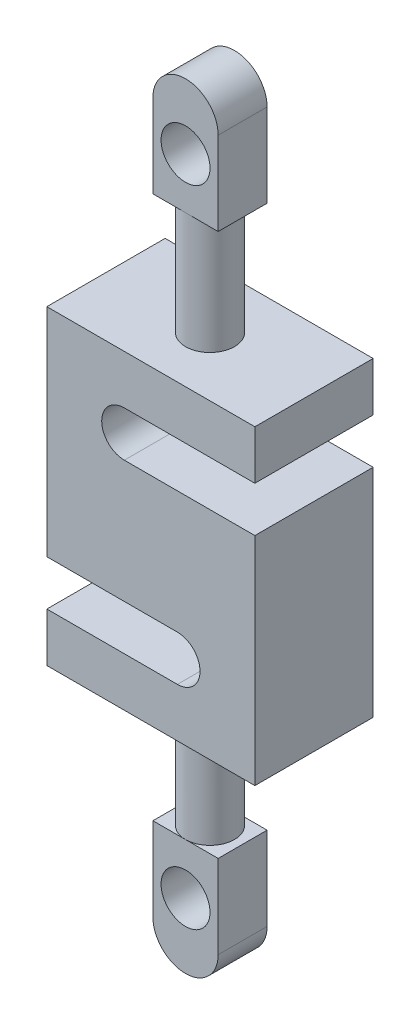
ISO-10303-21;
HEADER;
FILE_DESCRIPTION(('STEP AP214'),'2;1');
FILE_NAME('part.step','',(''),(''),'','','');
FILE_SCHEMA(('AUTOMOTIVE_DESIGN { 1 0 10303 214 1 1 1 1 }'));
ENDSEC;
DATA;
#1=APPLICATION_CONTEXT('core data for automotive mechanical design processes');
#2=APPLICATION_PROTOCOL_DEFINITION('international standard','automotive_design',2000,#1);
#3=PRODUCT_CONTEXT('',#1,'mechanical');
#4=PRODUCT('Part','Part','',(#3));
#5=PRODUCT_RELATED_PRODUCT_CATEGORY('part','',(#4));
#6=PRODUCT_DEFINITION_FORMATION('','',#4);
#7=PRODUCT_DEFINITION_CONTEXT('part definition',#1,'design');
#8=PRODUCT_DEFINITION('design','',#6,#7);
#9=PRODUCT_DEFINITION_SHAPE('','',#8);
#10=(LENGTH_UNIT() NAMED_UNIT(*) SI_UNIT(.MILLI.,.METRE.));
#11=(NAMED_UNIT(*) PLANE_ANGLE_UNIT() SI_UNIT($,.RADIAN.));
#12=(NAMED_UNIT(*) SI_UNIT($,.STERADIAN.) SOLID_ANGLE_UNIT());
#13=UNCERTAINTY_MEASURE_WITH_UNIT(LENGTH_MEASURE(1.E-05),#10,'distance_accuracy_value','');
#14=(GEOMETRIC_REPRESENTATION_CONTEXT(3) GLOBAL_UNCERTAINTY_ASSIGNED_CONTEXT((#13)) GLOBAL_UNIT_ASSIGNED_CONTEXT((#10,
#11,#12)) REPRESENTATION_CONTEXT('',''));
#15=CARTESIAN_POINT('',(0.,0.,0.));
#16=DIRECTION('',(0.,0.,1.));
#17=DIRECTION('',(1.,0.,0.));
#18=AXIS2_PLACEMENT_3D('',#15,#16,#17);
#19=CARTESIAN_POINT('',(-51.,23.1,29.));
#20=DIRECTION('',(1.,0.,0.));
#21=DIRECTION('',(0.,0.,-1.));
#22=AXIS2_PLACEMENT_3D('',#19,#20,#21);
#23=PLANE('',#22);
#24=DIRECTION('',(0.,-1.,0.));
#25=VECTOR('',#24,1.);
#26=CARTESIAN_POINT('',(-51.,23.1,0.));
#27=LINE('',#26,#25);
#28=CARTESIAN_POINT('',(-51.,23.1,0.));
#29=VERTEX_POINT('',#28);
#30=CARTESIAN_POINT('',(-51.,-30.,0.));
#31=VERTEX_POINT('',#30);
#32=EDGE_CURVE('E165',#29,#31,#27,.T.);
#33=ORIENTED_EDGE('',*,*,#32,.T.);
#34=DIRECTION('',(0.,0.,-1.));
#35=VECTOR('',#34,1.);
#36=CARTESIAN_POINT('',(-51.,-30.,29.));
#37=LINE('',#36,#35);
#38=CARTESIAN_POINT('',(-51.,-30.,29.));
#39=VERTEX_POINT('',#38);
#40=EDGE_CURVE('E36',#39,#31,#37,.T.);
#41=ORIENTED_EDGE('',*,*,#40,.F.);
#42=DIRECTION('',(0.,-1.,0.));
#43=VECTOR('',#42,1.);
#44=CARTESIAN_POINT('',(-51.,23.1,29.));
#45=LINE('',#44,#43);
#46=CARTESIAN_POINT('',(-51.,23.1,29.));
#47=VERTEX_POINT('',#46);
#48=EDGE_CURVE('E189',#47,#39,#45,.T.);
#49=ORIENTED_EDGE('',*,*,#48,.F.);
#50=DIRECTION('',(0.,0.,-1.));
#51=VECTOR('',#50,1.);
#52=CARTESIAN_POINT('',(-51.,23.1,29.));
#53=LINE('',#52,#51);
#54=EDGE_CURVE('E161',#47,#29,#53,.T.);
#55=ORIENTED_EDGE('',*,*,#54,.T.);
#56=EDGE_LOOP('',(#33,#41,#49,#55));
#57=FACE_BOUND('',#56,.T.);
#58=ADVANCED_FACE('F33',(#57),#23,.F.);
#59=CARTESIAN_POINT('',(-51.,-30.,29.));
#60=DIRECTION('',(0.,1.,0.));
#61=DIRECTION('',(0.,0.,1.));
#62=AXIS2_PLACEMENT_3D('',#59,#60,#61);
#63=PLANE('',#62);
#64=DIRECTION('',(1.,0.,0.));
#65=VECTOR('',#64,1.);
#66=CARTESIAN_POINT('',(-51.,-30.,0.));
#67=LINE('',#66,#65);
#68=CARTESIAN_POINT('',(-19.,-30.,0.));
#69=VERTEX_POINT('',#68);
#70=EDGE_CURVE('E168',#31,#69,#67,.T.);
#71=ORIENTED_EDGE('',*,*,#70,.T.);
#72=DIRECTION('',(0.,0.,-1.));
#73=VECTOR('',#72,1.);
#74=CARTESIAN_POINT('',(-19.,-30.,29.));
#75=LINE('',#74,#73);
#76=CARTESIAN_POINT('',(-19.,-30.,29.));
#77=VERTEX_POINT('',#76);
#78=EDGE_CURVE('E210',#77,#69,#75,.T.);
#79=ORIENTED_EDGE('',*,*,#78,.F.);
#80=DIRECTION('',(1.,0.,0.));
#81=VECTOR('',#80,1.);
#82=CARTESIAN_POINT('',(-51.,-30.,29.));
#83=LINE('',#82,#81);
#84=EDGE_CURVE('E110',#39,#77,#83,.T.);
#85=ORIENTED_EDGE('',*,*,#84,.F.);
#86=ORIENTED_EDGE('',*,*,#40,.T.);
#87=EDGE_LOOP('',(#71,#79,#85,#86));
#88=FACE_BOUND('',#87,.T.);
#89=ADVANCED_FACE('F216',(#88),#63,.F.);
#90=CARTESIAN_POINT('',(-19.,-35.55,29.));
#91=DIRECTION('',(0.,0.,-1.));
#92=DIRECTION('',(-1.,0.,0.));
#93=AXIS2_PLACEMENT_3D('',#90,#91,#92);
#94=CYLINDRICAL_SURFACE('',#93,5.55);
#95=CARTESIAN_POINT('',(-19.,-35.55,0.));
#96=DIRECTION('',(0.,0.,-1.));
#97=DIRECTION('',(-1.,0.,0.));
#98=AXIS2_PLACEMENT_3D('',#95,#96,#97);
#99=CIRCLE('',#98,5.55);
#100=CARTESIAN_POINT('',(-19.,-41.1,0.));
#101=VERTEX_POINT('',#100);
#102=EDGE_CURVE('E171',#69,#101,#99,.T.);
#103=ORIENTED_EDGE('',*,*,#102,.T.);
#104=DIRECTION('',(0.,0.,-1.));
#105=VECTOR('',#104,1.);
#106=CARTESIAN_POINT('',(-19.,-41.1,29.));
#107=LINE('',#106,#105);
#108=CARTESIAN_POINT('',(-19.,-41.1,29.));
#109=VERTEX_POINT('',#108);
#110=EDGE_CURVE('E208',#109,#101,#107,.T.);
#111=ORIENTED_EDGE('',*,*,#110,.F.);
#112=CARTESIAN_POINT('',(-19.,-35.55,29.));
#113=DIRECTION('',(0.,0.,-1.));
#114=DIRECTION('',(-1.,0.,0.));
#115=AXIS2_PLACEMENT_3D('',#112,#113,#114);
#116=CIRCLE('',#115,5.55);
#117=EDGE_CURVE('E233',#77,#109,#116,.T.);
#118=ORIENTED_EDGE('',*,*,#117,.F.);
#119=ORIENTED_EDGE('',*,*,#78,.T.);
#120=EDGE_LOOP('',(#103,#111,#118,#119));
#121=FACE_BOUND('',#120,.T.);
#122=ADVANCED_FACE('F225',(#121),#94,.F.);
#123=CARTESIAN_POINT('',(-19.,-41.1,29.));
#124=DIRECTION('',(0.,-1.,0.));
#125=DIRECTION('',(1.,0.,0.));
#126=AXIS2_PLACEMENT_3D('',#123,#124,#125);
#127=PLANE('',#126);
#128=DIRECTION('',(-1.,0.,0.));
#129=VECTOR('',#128,1.);
#130=CARTESIAN_POINT('',(-19.,-41.1,0.));
#131=LINE('',#130,#129);
#132=CARTESIAN_POINT('',(-51.,-41.1,0.));
#133=VERTEX_POINT('',#132);
#134=EDGE_CURVE('E173',#101,#133,#131,.T.);
#135=ORIENTED_EDGE('',*,*,#134,.T.);
#136=DIRECTION('',(0.,0.,-1.));
#137=VECTOR('',#136,1.);
#138=CARTESIAN_POINT('',(-51.,-41.1,29.));
#139=LINE('',#138,#137);
#140=CARTESIAN_POINT('',(-51.,-41.1,29.));
#141=VERTEX_POINT('',#140);
#142=EDGE_CURVE('E205',#141,#133,#139,.T.);
#143=ORIENTED_EDGE('',*,*,#142,.F.);
#144=DIRECTION('',(-1.,0.,0.));
#145=VECTOR('',#144,1.);
#146=CARTESIAN_POINT('',(-19.,-41.1,29.));
#147=LINE('',#146,#145);
#148=EDGE_CURVE('E230',#109,#141,#147,.T.);
#149=ORIENTED_EDGE('',*,*,#148,.F.);
#150=ORIENTED_EDGE('',*,*,#110,.T.);
#151=EDGE_LOOP('',(#135,#143,#149,#150));
#152=FACE_BOUND('',#151,.T.);
#153=ADVANCED_FACE('F228',(#152),#127,.F.);
#154=CARTESIAN_POINT('',(-51.,-41.1,29.));
#155=DIRECTION('',(1.,0.,0.));
#156=DIRECTION('',(0.,0.,-1.));
#157=AXIS2_PLACEMENT_3D('',#154,#155,#156);
#158=PLANE('',#157);
#159=DIRECTION('',(0.,-1.,0.));
#160=VECTOR('',#159,1.);
#161=CARTESIAN_POINT('',(-51.,-41.1,0.));
#162=LINE('',#161,#160);
#163=CARTESIAN_POINT('',(-51.,-53.1,0.));
#164=VERTEX_POINT('',#163);
#165=EDGE_CURVE('E175',#133,#164,#162,.T.);
#166=ORIENTED_EDGE('',*,*,#165,.T.);
#167=DIRECTION('',(0.,0.,-1.));
#168=VECTOR('',#167,1.);
#169=CARTESIAN_POINT('',(-51.,-53.1,29.));
#170=LINE('',#169,#168);
#171=CARTESIAN_POINT('',(-51.,-53.1,29.));
#172=VERTEX_POINT('',#171);
#173=EDGE_CURVE('E202',#172,#164,#170,.T.);
#174=ORIENTED_EDGE('',*,*,#173,.F.);
#175=DIRECTION('',(0.,-1.,0.));
#176=VECTOR('',#175,1.);
#177=CARTESIAN_POINT('',(-51.,-41.1,29.));
#178=LINE('',#177,#176);
#179=EDGE_CURVE('E232',#141,#172,#178,.T.);
#180=ORIENTED_EDGE('',*,*,#179,.F.);
#181=ORIENTED_EDGE('',*,*,#142,.T.);
#182=EDGE_LOOP('',(#166,#174,#180,#181));
#183=FACE_BOUND('',#182,.T.);
#184=ADVANCED_FACE('F387',(#183),#158,.F.);
#185=CARTESIAN_POINT('',(-51.,-53.1,29.));
#186=DIRECTION('',(0.,1.,0.));
#187=DIRECTION('',(0.,0.,1.));
#188=AXIS2_PLACEMENT_3D('',#185,#186,#187);
#189=PLANE('',#188);
#190=CARTESIAN_POINT('',(-25.5,-53.1,14.5));
#191=DIRECTION('',(0.,1.,0.));
#192=DIRECTION('',(-1.,0.,0.));
#193=AXIS2_PLACEMENT_3D('',#190,#191,#192);
#194=CIRCLE('',#193,6.);
#195=CARTESIAN_POINT('',(-31.5,-53.1,14.5));
#196=VERTEX_POINT('',#195);
#197=EDGE_CURVE('E350',#196,#196,#194,.T.);
#198=ORIENTED_EDGE('',*,*,#197,.T.);
#199=EDGE_LOOP('',(#198));
#200=FACE_BOUND('',#199,.T.);
#201=DIRECTION('',(1.,0.,0.));
#202=VECTOR('',#201,1.);
#203=CARTESIAN_POINT('',(-51.,-53.1,0.));
#204=LINE('',#203,#202);
#205=CARTESIAN_POINT('',(0.,-53.1,0.));
#206=VERTEX_POINT('',#205);
#207=EDGE_CURVE('E177',#164,#206,#204,.T.);
#208=ORIENTED_EDGE('',*,*,#207,.T.);
#209=DIRECTION('',(0.,0.,-1.));
#210=VECTOR('',#209,1.);
#211=CARTESIAN_POINT('',(0.,-53.1,29.));
#212=LINE('',#211,#210);
#213=CARTESIAN_POINT('',(0.,-53.1,29.));
#214=VERTEX_POINT('',#213);
#215=EDGE_CURVE('E199',#214,#206,#212,.T.);
#216=ORIENTED_EDGE('',*,*,#215,.F.);
#217=DIRECTION('',(1.,0.,0.));
#218=VECTOR('',#217,1.);
#219=CARTESIAN_POINT('',(-51.,-53.1,29.));
#220=LINE('',#219,#218);
#221=EDGE_CURVE('E235',#172,#214,#220,.T.);
#222=ORIENTED_EDGE('',*,*,#221,.F.);
#223=ORIENTED_EDGE('',*,*,#173,.T.);
#224=EDGE_LOOP('',(#208,#216,#222,#223));
#225=FACE_BOUND('',#224,.T.);
#226=ADVANCED_FACE('F354',(#200,#225),#189,.F.);
#227=CARTESIAN_POINT('',(0.,-53.1,29.));
#228=DIRECTION('',(-1.,0.,0.));
#229=DIRECTION('',(0.,0.,1.));
#230=AXIS2_PLACEMENT_3D('',#227,#228,#229);
#231=PLANE('',#230);
#232=DIRECTION('',(0.,1.,0.));
#233=VECTOR('',#232,1.);
#234=CARTESIAN_POINT('',(0.,-53.1,0.));
#235=LINE('',#234,#233);
#236=CARTESIAN_POINT('',(0.,0.,0.));
#237=VERTEX_POINT('',#236);
#238=EDGE_CURVE('E179',#206,#237,#235,.T.);
#239=ORIENTED_EDGE('',*,*,#238,.T.);
#240=DIRECTION('',(0.,0.,-1.));
#241=VECTOR('',#240,1.);
#242=CARTESIAN_POINT('',(0.,0.,29.));
#243=LINE('',#242,#241);
#244=CARTESIAN_POINT('',(0.,0.,29.));
#245=VERTEX_POINT('',#244);
#246=EDGE_CURVE('E196',#245,#237,#243,.T.);
#247=ORIENTED_EDGE('',*,*,#246,.F.);
#248=DIRECTION('',(0.,1.,0.));
#249=VECTOR('',#248,1.);
#250=CARTESIAN_POINT('',(0.,-53.1,29.));
#251=LINE('',#250,#249);
#252=EDGE_CURVE('E241',#214,#245,#251,.T.);
#253=ORIENTED_EDGE('',*,*,#252,.F.);
#254=ORIENTED_EDGE('',*,*,#215,.T.);
#255=EDGE_LOOP('',(#239,#247,#253,#254));
#256=FACE_BOUND('',#255,.T.);
#257=ADVANCED_FACE('F393',(#256),#231,.F.);
#258=CARTESIAN_POINT('',(0.,0.,29.));
#259=DIRECTION('',(0.,-1.,0.));
#260=DIRECTION('',(1.,0.,0.));
#261=AXIS2_PLACEMENT_3D('',#258,#259,#260);
#262=PLANE('',#261);
#263=DIRECTION('',(-1.,0.,0.));
#264=VECTOR('',#263,1.);
#265=CARTESIAN_POINT('',(0.,0.,0.));
#266=LINE('',#265,#264);
#267=CARTESIAN_POINT('',(-32.,0.,0.));
#268=VERTEX_POINT('',#267);
#269=EDGE_CURVE('E181',#237,#268,#266,.T.);
#270=ORIENTED_EDGE('',*,*,#269,.T.);
#271=DIRECTION('',(0.,0.,-1.));
#272=VECTOR('',#271,1.);
#273=CARTESIAN_POINT('',(-32.,0.,29.));
#274=LINE('',#273,#272);
#275=CARTESIAN_POINT('',(-32.,0.,29.));
#276=VERTEX_POINT('',#275);
#277=EDGE_CURVE('E193',#276,#268,#274,.T.);
#278=ORIENTED_EDGE('',*,*,#277,.F.);
#279=DIRECTION('',(-1.,0.,0.));
#280=VECTOR('',#279,1.);
#281=CARTESIAN_POINT('',(0.,0.,29.));
#282=LINE('',#281,#280);
#283=EDGE_CURVE('E243',#245,#276,#282,.T.);
#284=ORIENTED_EDGE('',*,*,#283,.F.);
#285=ORIENTED_EDGE('',*,*,#246,.T.);
#286=EDGE_LOOP('',(#270,#278,#284,#285));
#287=FACE_BOUND('',#286,.T.);
#288=ADVANCED_FACE('F249',(#287),#262,.F.);
#289=CARTESIAN_POINT('',(-32.,5.55,29.));
#290=DIRECTION('',(0.,0.,-1.));
#291=DIRECTION('',(-1.,0.,0.));
#292=AXIS2_PLACEMENT_3D('',#289,#290,#291);
#293=CYLINDRICAL_SURFACE('',#292,5.55);
#294=CARTESIAN_POINT('',(-32.,5.55,0.));
#295=DIRECTION('',(0.,0.,-1.));
#296=DIRECTION('',(1.,0.,0.));
#297=AXIS2_PLACEMENT_3D('',#294,#295,#296);
#298=CIRCLE('',#297,5.55);
#299=CARTESIAN_POINT('',(-32.,11.1,0.));
#300=VERTEX_POINT('',#299);
#301=EDGE_CURVE('E183',#268,#300,#298,.T.);
#302=ORIENTED_EDGE('',*,*,#301,.T.);
#303=DIRECTION('',(0.,0.,-1.));
#304=VECTOR('',#303,1.);
#305=CARTESIAN_POINT('',(-32.,11.1,29.));
#306=LINE('',#305,#304);
#307=CARTESIAN_POINT('',(-32.,11.1,29.));
#308=VERTEX_POINT('',#307);
#309=EDGE_CURVE('E156',#308,#300,#306,.T.);
#310=ORIENTED_EDGE('',*,*,#309,.F.);
#311=CARTESIAN_POINT('',(-32.,5.55,29.));
#312=DIRECTION('',(0.,0.,-1.));
#313=DIRECTION('',(1.,0.,0.));
#314=AXIS2_PLACEMENT_3D('',#311,#312,#313);
#315=CIRCLE('',#314,5.55);
#316=EDGE_CURVE('E144',#276,#308,#315,.T.);
#317=ORIENTED_EDGE('',*,*,#316,.F.);
#318=ORIENTED_EDGE('',*,*,#277,.T.);
#319=EDGE_LOOP('',(#302,#310,#317,#318));
#320=FACE_BOUND('',#319,.T.);
#321=ADVANCED_FACE('F253',(#320),#293,.F.);
#322=CARTESIAN_POINT('',(0.,11.1,29.));
#323=DIRECTION('',(0.,1.,0.));
#324=DIRECTION('',(0.,0.,1.));
#325=AXIS2_PLACEMENT_3D('',#322,#323,#324);
#326=PLANE('',#325);
#327=DIRECTION('',(1.,0.,0.));
#328=VECTOR('',#327,1.);
#329=CARTESIAN_POINT('',(0.,11.1,0.));
#330=LINE('',#329,#328);
#331=CARTESIAN_POINT('',(0.,11.1,0.));
#332=VERTEX_POINT('',#331);
#333=EDGE_CURVE('E153',#300,#332,#330,.T.);
#334=ORIENTED_EDGE('',*,*,#333,.T.);
#335=DIRECTION('',(0.,0.,-1.));
#336=VECTOR('',#335,1.);
#337=CARTESIAN_POINT('',(0.,11.1,29.));
#338=LINE('',#337,#336);
#339=CARTESIAN_POINT('',(0.,11.1,29.));
#340=VERTEX_POINT('',#339);
#341=EDGE_CURVE('E150',#340,#332,#338,.T.);
#342=ORIENTED_EDGE('',*,*,#341,.F.);
#343=DIRECTION('',(1.,0.,0.));
#344=VECTOR('',#343,1.);
#345=CARTESIAN_POINT('',(0.,11.1,29.));
#346=LINE('',#345,#344);
#347=EDGE_CURVE('E137',#308,#340,#346,.T.);
#348=ORIENTED_EDGE('',*,*,#347,.F.);
#349=ORIENTED_EDGE('',*,*,#309,.T.);
#350=EDGE_LOOP('',(#334,#342,#348,#349));
#351=FACE_BOUND('',#350,.T.);
#352=ADVANCED_FACE('F151',(#351),#326,.F.);
#353=CARTESIAN_POINT('',(0.,23.1,29.));
#354=DIRECTION('',(-1.,0.,0.));
#355=DIRECTION('',(0.,0.,1.));
#356=AXIS2_PLACEMENT_3D('',#353,#354,#355);
#357=PLANE('',#356);
#358=DIRECTION('',(0.,1.,0.));
#359=VECTOR('',#358,1.);
#360=CARTESIAN_POINT('',(0.,23.1,0.));
#361=LINE('',#360,#359);
#362=CARTESIAN_POINT('',(0.,23.1,0.));
#363=VERTEX_POINT('',#362);
#364=EDGE_CURVE('E186',#332,#363,#361,.T.);
#365=ORIENTED_EDGE('',*,*,#364,.T.);
#366=DIRECTION('',(0.,0.,-1.));
#367=VECTOR('',#366,1.);
#368=CARTESIAN_POINT('',(0.,23.1,29.));
#369=LINE('',#368,#367);
#370=CARTESIAN_POINT('',(0.,23.1,29.));
#371=VERTEX_POINT('',#370);
#372=EDGE_CURVE('E157',#371,#363,#369,.T.);
#373=ORIENTED_EDGE('',*,*,#372,.F.);
#374=DIRECTION('',(0.,1.,0.));
#375=VECTOR('',#374,1.);
#376=CARTESIAN_POINT('',(0.,23.1,29.));
#377=LINE('',#376,#375);
#378=EDGE_CURVE('E141',#340,#371,#377,.T.);
#379=ORIENTED_EDGE('',*,*,#378,.F.);
#380=ORIENTED_EDGE('',*,*,#341,.T.);
#381=EDGE_LOOP('',(#365,#373,#379,#380));
#382=FACE_BOUND('',#381,.T.);
#383=ADVANCED_FACE('F159',(#382),#357,.F.);
#384=CARTESIAN_POINT('',(-51.,23.1,29.));
#385=DIRECTION('',(0.,-1.,0.));
#386=DIRECTION('',(1.,0.,0.));
#387=AXIS2_PLACEMENT_3D('',#384,#385,#386);
#388=PLANE('',#387);
#389=CARTESIAN_POINT('',(-25.5,23.1,14.5));
#390=DIRECTION('',(0.,1.,0.));
#391=DIRECTION('',(-1.,0.,0.));
#392=AXIS2_PLACEMENT_3D('',#389,#390,#391);
#393=CIRCLE('',#392,6.);
#394=CARTESIAN_POINT('',(-31.5,23.1,14.5));
#395=VERTEX_POINT('',#394);
#396=EDGE_CURVE('E11',#395,#395,#393,.T.);
#397=ORIENTED_EDGE('',*,*,#396,.F.);
#398=EDGE_LOOP('',(#397));
#399=FACE_BOUND('',#398,.T.);
#400=DIRECTION('',(-1.,0.,0.));
#401=VECTOR('',#400,1.);
#402=CARTESIAN_POINT('',(-51.,23.1,0.));
#403=LINE('',#402,#401);
#404=EDGE_CURVE('E101',#363,#29,#403,.T.);
#405=ORIENTED_EDGE('',*,*,#404,.T.);
#406=ORIENTED_EDGE('',*,*,#54,.F.);
#407=DIRECTION('',(-1.,0.,0.));
#408=VECTOR('',#407,1.);
#409=CARTESIAN_POINT('',(-51.,23.1,29.));
#410=LINE('',#409,#408);
#411=EDGE_CURVE('E56',#371,#47,#410,.T.);
#412=ORIENTED_EDGE('',*,*,#411,.F.);
#413=ORIENTED_EDGE('',*,*,#372,.T.);
#414=EDGE_LOOP('',(#405,#406,#412,#413));
#415=FACE_BOUND('',#414,.T.);
#416=ADVANCED_FACE('F254',(#399,#415),#388,.F.);
#417=CARTESIAN_POINT('',(-19.,-35.55,29.));
#418=DIRECTION('',(0.,0.,-1.));
#419=DIRECTION('',(-1.,0.,0.));
#420=AXIS2_PLACEMENT_3D('',#417,#418,#419);
#421=PLANE('',#420);
#422=ORIENTED_EDGE('',*,*,#48,.T.);
#423=ORIENTED_EDGE('',*,*,#84,.T.);
#424=ORIENTED_EDGE('',*,*,#117,.T.);
#425=ORIENTED_EDGE('',*,*,#148,.T.);
#426=ORIENTED_EDGE('',*,*,#179,.T.);
#427=ORIENTED_EDGE('',*,*,#221,.T.);
#428=ORIENTED_EDGE('',*,*,#252,.T.);
#429=ORIENTED_EDGE('',*,*,#283,.T.);
#430=ORIENTED_EDGE('',*,*,#316,.T.);
#431=ORIENTED_EDGE('',*,*,#347,.T.);
#432=ORIENTED_EDGE('',*,*,#378,.T.);
#433=ORIENTED_EDGE('',*,*,#411,.T.);
#434=EDGE_LOOP('',(#422,#423,#424,#425,#426,#427,#428,#429,#430,#431,#432,#433));
#435=FACE_BOUND('',#434,.T.);
#436=ADVANCED_FACE('F139',(#435),#421,.F.);
#437=CARTESIAN_POINT('',(-19.,-35.55,0.));
#438=DIRECTION('',(0.,0.,-1.));
#439=DIRECTION('',(-1.,0.,0.));
#440=AXIS2_PLACEMENT_3D('',#437,#438,#439);
#441=PLANE('',#440);
#442=ORIENTED_EDGE('',*,*,#32,.F.);
#443=ORIENTED_EDGE('',*,*,#404,.F.);
#444=ORIENTED_EDGE('',*,*,#364,.F.);
#445=ORIENTED_EDGE('',*,*,#333,.F.);
#446=ORIENTED_EDGE('',*,*,#301,.F.);
#447=ORIENTED_EDGE('',*,*,#269,.F.);
#448=ORIENTED_EDGE('',*,*,#238,.F.);
#449=ORIENTED_EDGE('',*,*,#207,.F.);
#450=ORIENTED_EDGE('',*,*,#165,.F.);
#451=ORIENTED_EDGE('',*,*,#134,.F.);
#452=ORIENTED_EDGE('',*,*,#102,.F.);
#453=ORIENTED_EDGE('',*,*,#70,.F.);
#454=EDGE_LOOP('',(#442,#443,#444,#445,#446,#447,#448,#449,#450,#451,#452,#453));
#455=FACE_BOUND('',#454,.T.);
#456=ADVANCED_FACE('F221',(#455),#441,.T.);
#457=CARTESIAN_POINT('',(-25.5,51.55,14.5));
#458=DIRECTION('',(0.,-1.,0.));
#459=DIRECTION('',(1.,0.,0.));
#460=AXIS2_PLACEMENT_3D('',#457,#458,#459);
#461=CYLINDRICAL_SURFACE('',#460,6.);
#462=CARTESIAN_POINT('',(-25.5,51.55,14.5));
#463=DIRECTION('',(0.,1.,0.));
#464=DIRECTION('',(-1.,0.,0.));
#465=AXIS2_PLACEMENT_3D('',#462,#463,#464);
#466=CIRCLE('',#465,6.);
#467=CARTESIAN_POINT('',(-25.5,51.55,20.5));
#468=VERTEX_POINT('',#467);
#469=CARTESIAN_POINT('',(-25.5,51.55,8.5));
#470=VERTEX_POINT('',#469);
#471=EDGE_CURVE('E169',#468,#470,#466,.T.);
#472=ORIENTED_EDGE('',*,*,#471,.F.);
#473=EDGE_CURVE('E47',#470,#468,#466,.T.);
#474=ORIENTED_EDGE('',*,*,#473,.F.);
#475=EDGE_LOOP('',(#472,#474));
#476=FACE_BOUND('',#475,.T.);
#477=ORIENTED_EDGE('',*,*,#396,.T.);
#478=EDGE_LOOP('',(#477));
#479=FACE_BOUND('',#478,.T.);
#480=ADVANCED_FACE('F410',(#476,#479),#461,.T.);
#481=CARTESIAN_POINT('',(0.,51.55,0.));
#482=DIRECTION('',(0.,-1.,0.));
#483=DIRECTION('',(0.,0.,-1.));
#484=AXIS2_PLACEMENT_3D('',#481,#482,#483);
#485=PLANE('',#484);
#486=DIRECTION('',(1.,0.,0.));
#487=VECTOR('',#486,1.);
#488=CARTESIAN_POINT('',(-33.5,51.55,20.5));
#489=LINE('',#488,#487);
#490=CARTESIAN_POINT('',(-17.5,51.55,20.5));
#491=VERTEX_POINT('',#490);
#492=EDGE_CURVE('E275',#468,#491,#489,.T.);
#493=ORIENTED_EDGE('',*,*,#492,.F.);
#494=ORIENTED_EDGE('',*,*,#471,.T.);
#495=DIRECTION('',(-1.,0.,0.));
#496=VECTOR('',#495,1.);
#497=CARTESIAN_POINT('',(-33.5,51.55,8.5));
#498=LINE('',#497,#496);
#499=CARTESIAN_POINT('',(-17.5,51.55,8.5));
#500=VERTEX_POINT('',#499);
#501=EDGE_CURVE('E279',#500,#470,#498,.T.);
#502=ORIENTED_EDGE('',*,*,#501,.F.);
#503=DIRECTION('',(0.,0.,-1.));
#504=VECTOR('',#503,1.);
#505=CARTESIAN_POINT('',(-17.5,51.55,20.5));
#506=LINE('',#505,#504);
#507=EDGE_CURVE('E283',#491,#500,#506,.T.);
#508=ORIENTED_EDGE('',*,*,#507,.F.);
#509=EDGE_LOOP('',(#493,#494,#502,#508));
#510=FACE_BOUND('',#509,.T.);
#511=ADVANCED_FACE('F415',(#510),#485,.T.);
#512=CARTESIAN_POINT('',(-17.5,72.,20.5));
#513=DIRECTION('',(-1.,0.,0.));
#514=DIRECTION('',(0.,-1.,0.));
#515=AXIS2_PLACEMENT_3D('',#512,#513,#514);
#516=PLANE('',#515);
#517=ORIENTED_EDGE('',*,*,#507,.T.);
#518=DIRECTION('',(0.,-1.,0.));
#519=VECTOR('',#518,1.);
#520=CARTESIAN_POINT('',(-17.5,72.,8.5));
#521=LINE('',#520,#519);
#522=CARTESIAN_POINT('',(-17.5,72.,8.5));
#523=VERTEX_POINT('',#522);
#524=EDGE_CURVE('E258',#523,#500,#521,.T.);
#525=ORIENTED_EDGE('',*,*,#524,.F.);
#526=DIRECTION('',(0.,0.,-1.));
#527=VECTOR('',#526,1.);
#528=CARTESIAN_POINT('',(-17.5,72.,20.5));
#529=LINE('',#528,#527);
#530=CARTESIAN_POINT('',(-17.5,72.,20.5));
#531=VERTEX_POINT('',#530);
#532=EDGE_CURVE('E274',#531,#523,#529,.T.);
#533=ORIENTED_EDGE('',*,*,#532,.F.);
#534=DIRECTION('',(0.,-1.,0.));
#535=VECTOR('',#534,1.);
#536=CARTESIAN_POINT('',(-17.5,72.,20.5));
#537=LINE('',#536,#535);
#538=EDGE_CURVE('E267',#531,#491,#537,.T.);
#539=ORIENTED_EDGE('',*,*,#538,.T.);
#540=EDGE_LOOP('',(#517,#525,#533,#539));
#541=FACE_BOUND('',#540,.T.);
#542=ADVANCED_FACE('F416',(#541),#516,.F.);
#543=CARTESIAN_POINT('',(-33.5,72.,8.5));
#544=DIRECTION('',(0.,0.,1.));
#545=DIRECTION('',(1.,0.,0.));
#546=AXIS2_PLACEMENT_3D('',#543,#544,#545);
#547=PLANE('',#546);
#548=CARTESIAN_POINT('',(-25.5,64.,8.5));
#549=DIRECTION('',(0.,0.,1.));
#550=DIRECTION('',(1.,0.,0.));
#551=AXIS2_PLACEMENT_3D('',#548,#549,#550);
#552=CIRCLE('',#551,6.);
#553=CARTESIAN_POINT('',(-19.5,64.,8.5));
#554=VERTEX_POINT('',#553);
#555=EDGE_CURVE('E294',#554,#554,#552,.T.);
#556=ORIENTED_EDGE('',*,*,#555,.T.);
#557=EDGE_LOOP('',(#556));
#558=FACE_BOUND('',#557,.T.);
#559=ORIENTED_EDGE('',*,*,#501,.T.);
#560=CARTESIAN_POINT('',(-33.5,51.55,8.5));
#561=VERTEX_POINT('',#560);
#562=EDGE_CURVE('E282',#470,#561,#498,.T.);
#563=ORIENTED_EDGE('',*,*,#562,.T.);
#564=DIRECTION('',(0.,-1.,0.));
#565=VECTOR('',#564,1.);
#566=CARTESIAN_POINT('',(-33.5,72.,8.5));
#567=LINE('',#566,#565);
#568=CARTESIAN_POINT('',(-33.5,72.,8.5));
#569=VERTEX_POINT('',#568);
#570=EDGE_CURVE('E261',#569,#561,#567,.T.);
#571=ORIENTED_EDGE('',*,*,#570,.F.);
#572=CARTESIAN_POINT('',(-25.5,72.,8.5));
#573=DIRECTION('',(0.,0.,1.));
#574=DIRECTION('',(-1.,0.,0.));
#575=AXIS2_PLACEMENT_3D('',#572,#573,#574);
#576=CIRCLE('',#575,8.);
#577=EDGE_CURVE('E286',#523,#569,#576,.T.);
#578=ORIENTED_EDGE('',*,*,#577,.F.);
#579=ORIENTED_EDGE('',*,*,#524,.T.);
#580=EDGE_LOOP('',(#559,#563,#571,#578,#579));
#581=FACE_BOUND('',#580,.T.);
#582=ADVANCED_FACE('F419',(#558,#581),#547,.F.);
#583=CARTESIAN_POINT('',(-33.5,72.,20.5));
#584=DIRECTION('',(1.,0.,0.));
#585=DIRECTION('',(0.,1.,0.));
#586=AXIS2_PLACEMENT_3D('',#583,#584,#585);
#587=PLANE('',#586);
#588=DIRECTION('',(0.,0.,1.));
#589=VECTOR('',#588,1.);
#590=CARTESIAN_POINT('',(-33.5,51.55,20.5));
#591=LINE('',#590,#589);
#592=CARTESIAN_POINT('',(-33.5,51.55,20.5));
#593=VERTEX_POINT('',#592);
#594=EDGE_CURVE('E276',#561,#593,#591,.T.);
#595=ORIENTED_EDGE('',*,*,#594,.T.);
#596=DIRECTION('',(0.,-1.,0.));
#597=VECTOR('',#596,1.);
#598=CARTESIAN_POINT('',(-33.5,72.,20.5));
#599=LINE('',#598,#597);
#600=CARTESIAN_POINT('',(-33.5,72.,20.5));
#601=VERTEX_POINT('',#600);
#602=EDGE_CURVE('E264',#601,#593,#599,.T.);
#603=ORIENTED_EDGE('',*,*,#602,.F.);
#604=DIRECTION('',(0.,0.,1.));
#605=VECTOR('',#604,1.);
#606=CARTESIAN_POINT('',(-33.5,72.,20.5));
#607=LINE('',#606,#605);
#608=EDGE_CURVE('E270',#569,#601,#607,.T.);
#609=ORIENTED_EDGE('',*,*,#608,.F.);
#610=ORIENTED_EDGE('',*,*,#570,.T.);
#611=EDGE_LOOP('',(#595,#603,#609,#610));
#612=FACE_BOUND('',#611,.T.);
#613=ADVANCED_FACE('F423',(#612),#587,.F.);
#614=CARTESIAN_POINT('',(-33.5,72.,20.5));
#615=DIRECTION('',(0.,0.,-1.));
#616=DIRECTION('',(-1.,0.,0.));
#617=AXIS2_PLACEMENT_3D('',#614,#615,#616);
#618=PLANE('',#617);
#619=CARTESIAN_POINT('',(-25.5,64.,20.5));
#620=DIRECTION('',(0.,0.,1.));
#621=DIRECTION('',(1.,0.,0.));
#622=AXIS2_PLACEMENT_3D('',#619,#620,#621);
#623=CIRCLE('',#622,6.);
#624=CARTESIAN_POINT('',(-19.5,64.,20.5));
#625=VERTEX_POINT('',#624);
#626=EDGE_CURVE('E299',#625,#625,#623,.T.);
#627=ORIENTED_EDGE('',*,*,#626,.F.);
#628=EDGE_LOOP('',(#627));
#629=FACE_BOUND('',#628,.T.);
#630=EDGE_CURVE('E271',#593,#468,#489,.T.);
#631=ORIENTED_EDGE('',*,*,#630,.T.);
#632=ORIENTED_EDGE('',*,*,#492,.T.);
#633=ORIENTED_EDGE('',*,*,#538,.F.);
#634=CARTESIAN_POINT('',(-25.5,72.,20.5));
#635=DIRECTION('',(0.,0.,1.));
#636=DIRECTION('',(-1.,0.,0.));
#637=AXIS2_PLACEMENT_3D('',#634,#635,#636);
#638=CIRCLE('',#637,8.);
#639=EDGE_CURVE('E291',#531,#601,#638,.T.);
#640=ORIENTED_EDGE('',*,*,#639,.T.);
#641=ORIENTED_EDGE('',*,*,#602,.T.);
#642=EDGE_LOOP('',(#631,#632,#633,#640,#641));
#643=FACE_BOUND('',#642,.T.);
#644=ADVANCED_FACE('F427',(#629,#643),#618,.F.);
#645=ORIENTED_EDGE('',*,*,#562,.F.);
#646=ORIENTED_EDGE('',*,*,#473,.T.);
#647=ORIENTED_EDGE('',*,*,#630,.F.);
#648=ORIENTED_EDGE('',*,*,#594,.F.);
#649=EDGE_LOOP('',(#645,#646,#647,#648));
#650=FACE_BOUND('',#649,.T.);
#651=ADVANCED_FACE('F431',(#650),#485,.T.);
#652=CARTESIAN_POINT('',(-25.5,72.,8.5));
#653=DIRECTION('',(0.,0.,1.));
#654=DIRECTION('',(1.,0.,0.));
#655=AXIS2_PLACEMENT_3D('',#652,#653,#654);
#656=CYLINDRICAL_SURFACE('',#655,8.);
#657=ORIENTED_EDGE('',*,*,#639,.F.);
#658=ORIENTED_EDGE('',*,*,#532,.T.);
#659=ORIENTED_EDGE('',*,*,#577,.T.);
#660=ORIENTED_EDGE('',*,*,#608,.T.);
#661=EDGE_LOOP('',(#657,#658,#659,#660));
#662=FACE_BOUND('',#661,.T.);
#663=ADVANCED_FACE('F435',(#662),#656,.T.);
#664=CARTESIAN_POINT('',(-25.5,64.,0.));
#665=DIRECTION('',(0.,0.,1.));
#666=DIRECTION('',(1.,0.,0.));
#667=AXIS2_PLACEMENT_3D('',#664,#665,#666);
#668=CYLINDRICAL_SURFACE('',#667,6.);
#669=ORIENTED_EDGE('',*,*,#626,.T.);
#670=EDGE_LOOP('',(#669));
#671=FACE_BOUND('',#670,.T.);
#672=ORIENTED_EDGE('',*,*,#555,.F.);
#673=EDGE_LOOP('',(#672));
#674=FACE_BOUND('',#673,.T.);
#675=ADVANCED_FACE('F439',(#671,#674),#668,.F.);
#676=CARTESIAN_POINT('',(-25.5,-94.,0.));
#677=DIRECTION('',(0.,0.,1.));
#678=DIRECTION('',(1.,0.,0.));
#679=AXIS2_PLACEMENT_3D('',#676,#677,#678);
#680=CYLINDRICAL_SURFACE('',#679,6.);
#681=CARTESIAN_POINT('',(-25.5,-94.,20.5));
#682=DIRECTION('',(0.,0.,-1.));
#683=DIRECTION('',(1.,0.,0.));
#684=AXIS2_PLACEMENT_3D('',#681,#682,#683);
#685=CIRCLE('',#684,6.);
#686=CARTESIAN_POINT('',(-19.5,-94.,20.5));
#687=VERTEX_POINT('',#686);
#688=EDGE_CURVE('E335',#687,#687,#685,.T.);
#689=ORIENTED_EDGE('',*,*,#688,.F.);
#690=EDGE_LOOP('',(#689));
#691=FACE_BOUND('',#690,.T.);
#692=CARTESIAN_POINT('',(-25.5,-94.,8.5));
#693=DIRECTION('',(0.,0.,-1.));
#694=DIRECTION('',(1.,0.,0.));
#695=AXIS2_PLACEMENT_3D('',#692,#693,#694);
#696=CIRCLE('',#695,6.);
#697=CARTESIAN_POINT('',(-19.5,-94.,8.5));
#698=VERTEX_POINT('',#697);
#699=EDGE_CURVE('E316',#698,#698,#696,.T.);
#700=ORIENTED_EDGE('',*,*,#699,.T.);
#701=EDGE_LOOP('',(#700));
#702=FACE_BOUND('',#701,.T.);
#703=ADVANCED_FACE('F371',(#691,#702),#680,.F.);
#704=CARTESIAN_POINT('',(-25.5,-102.,8.5));
#705=DIRECTION('',(0.,0.,1.));
#706=DIRECTION('',(1.,0.,0.));
#707=AXIS2_PLACEMENT_3D('',#704,#705,#706);
#708=CYLINDRICAL_SURFACE('',#707,8.);
#709=CARTESIAN_POINT('',(-25.5,-102.,20.5));
#710=DIRECTION('',(0.,0.,-1.));
#711=DIRECTION('',(-1.,0.,0.));
#712=AXIS2_PLACEMENT_3D('',#709,#710,#711);
#713=CIRCLE('',#712,8.);
#714=CARTESIAN_POINT('',(-17.5,-102.,20.5));
#715=VERTEX_POINT('',#714);
#716=CARTESIAN_POINT('',(-33.5,-102.,20.5));
#717=VERTEX_POINT('',#716);
#718=EDGE_CURVE('E328',#715,#717,#713,.T.);
#719=ORIENTED_EDGE('',*,*,#718,.T.);
#720=DIRECTION('',(0.,0.,1.));
#721=VECTOR('',#720,1.);
#722=CARTESIAN_POINT('',(-33.5,-102.,20.5));
#723=LINE('',#722,#721);
#724=CARTESIAN_POINT('',(-33.5,-102.,8.5));
#725=VERTEX_POINT('',#724);
#726=EDGE_CURVE('E322',#725,#717,#723,.T.);
#727=ORIENTED_EDGE('',*,*,#726,.F.);
#728=CARTESIAN_POINT('',(-25.5,-102.,8.5));
#729=DIRECTION('',(0.,0.,-1.));
#730=DIRECTION('',(-1.,0.,0.));
#731=AXIS2_PLACEMENT_3D('',#728,#729,#730);
#732=CIRCLE('',#731,8.);
#733=CARTESIAN_POINT('',(-17.5,-102.,8.5));
#734=VERTEX_POINT('',#733);
#735=EDGE_CURVE('E312',#734,#725,#732,.T.);
#736=ORIENTED_EDGE('',*,*,#735,.F.);
#737=DIRECTION('',(0.,0.,-1.));
#738=VECTOR('',#737,1.);
#739=CARTESIAN_POINT('',(-17.5,-102.,20.5));
#740=LINE('',#739,#738);
#741=EDGE_CURVE('E303',#715,#734,#740,.T.);
#742=ORIENTED_EDGE('',*,*,#741,.F.);
#743=EDGE_LOOP('',(#719,#727,#736,#742));
#744=FACE_BOUND('',#743,.T.);
#745=ADVANCED_FACE('F360',(#744),#708,.T.);
#746=CARTESIAN_POINT('',(-25.5,-81.55,14.5));
#747=DIRECTION('',(0.,1.,0.));
#748=DIRECTION('',(1.,0.,0.));
#749=AXIS2_PLACEMENT_3D('',#746,#747,#748);
#750=CYLINDRICAL_SURFACE('',#749,6.);
#751=CARTESIAN_POINT('',(-25.5,-81.55,14.5));
#752=DIRECTION('',(0.,1.,0.));
#753=DIRECTION('',(-1.,0.,0.));
#754=AXIS2_PLACEMENT_3D('',#751,#752,#753);
#755=CIRCLE('',#754,6.);
#756=CARTESIAN_POINT('',(-25.5,-81.55,20.5));
#757=VERTEX_POINT('',#756);
#758=CARTESIAN_POINT('',(-25.5,-81.55,8.5));
#759=VERTEX_POINT('',#758);
#760=EDGE_CURVE('E302',#757,#759,#755,.T.);
#761=ORIENTED_EDGE('',*,*,#760,.T.);
#762=EDGE_CURVE('E344',#759,#757,#755,.T.);
#763=ORIENTED_EDGE('',*,*,#762,.T.);
#764=EDGE_LOOP('',(#761,#763));
#765=FACE_BOUND('',#764,.T.);
#766=ORIENTED_EDGE('',*,*,#197,.F.);
#767=EDGE_LOOP('',(#766));
#768=FACE_BOUND('',#767,.T.);
#769=ADVANCED_FACE('F357',(#765,#768),#750,.T.);
#770=CARTESIAN_POINT('',(0.,-81.55,0.));
#771=DIRECTION('',(0.,1.,0.));
#772=DIRECTION('',(0.,0.,-1.));
#773=AXIS2_PLACEMENT_3D('',#770,#771,#772);
#774=PLANE('',#773);
#775=DIRECTION('',(1.,0.,0.));
#776=VECTOR('',#775,1.);
#777=CARTESIAN_POINT('',(-33.5,-81.55,20.5));
#778=LINE('',#777,#776);
#779=CARTESIAN_POINT('',(-17.5,-81.55,20.5));
#780=VERTEX_POINT('',#779);
#781=EDGE_CURVE('E334',#757,#780,#778,.T.);
#782=ORIENTED_EDGE('',*,*,#781,.T.);
#783=DIRECTION('',(0.,0.,-1.));
#784=VECTOR('',#783,1.);
#785=CARTESIAN_POINT('',(-17.5,-81.55,20.5));
#786=LINE('',#785,#784);
#787=CARTESIAN_POINT('',(-17.5,-81.55,8.5));
#788=VERTEX_POINT('',#787);
#789=EDGE_CURVE('E306',#780,#788,#786,.T.);
#790=ORIENTED_EDGE('',*,*,#789,.T.);
#791=DIRECTION('',(-1.,0.,0.));
#792=VECTOR('',#791,1.);
#793=CARTESIAN_POINT('',(-33.5,-81.55,8.5));
#794=LINE('',#793,#792);
#795=EDGE_CURVE('E315',#788,#759,#794,.T.);
#796=ORIENTED_EDGE('',*,*,#795,.T.);
#797=ORIENTED_EDGE('',*,*,#760,.F.);
#798=EDGE_LOOP('',(#782,#790,#796,#797));
#799=FACE_BOUND('',#798,.T.);
#800=ADVANCED_FACE('F359',(#799),#774,.T.);
#801=CARTESIAN_POINT('',(-17.5,-102.,20.5));
#802=DIRECTION('',(-1.,0.,0.));
#803=DIRECTION('',(0.,1.,0.));
#804=AXIS2_PLACEMENT_3D('',#801,#802,#803);
#805=PLANE('',#804);
#806=ORIENTED_EDGE('',*,*,#789,.F.);
#807=DIRECTION('',(0.,1.,0.));
#808=VECTOR('',#807,1.);
#809=CARTESIAN_POINT('',(-17.5,-102.,20.5));
#810=LINE('',#809,#808);
#811=EDGE_CURVE('E331',#715,#780,#810,.T.);
#812=ORIENTED_EDGE('',*,*,#811,.F.);
#813=ORIENTED_EDGE('',*,*,#741,.T.);
#814=DIRECTION('',(0.,1.,0.));
#815=VECTOR('',#814,1.);
#816=CARTESIAN_POINT('',(-17.5,-102.,8.5));
#817=LINE('',#816,#815);
#818=EDGE_CURVE('E309',#734,#788,#817,.T.);
#819=ORIENTED_EDGE('',*,*,#818,.T.);
#820=EDGE_LOOP('',(#806,#812,#813,#819));
#821=FACE_BOUND('',#820,.T.);
#822=ADVANCED_FACE('F367',(#821),#805,.F.);
#823=CARTESIAN_POINT('',(-33.5,-102.,8.5));
#824=DIRECTION('',(0.,0.,1.));
#825=DIRECTION('',(1.,0.,0.));
#826=AXIS2_PLACEMENT_3D('',#823,#824,#825);
#827=PLANE('',#826);
#828=ORIENTED_EDGE('',*,*,#699,.F.);
#829=EDGE_LOOP('',(#828));
#830=FACE_BOUND('',#829,.T.);
#831=ORIENTED_EDGE('',*,*,#795,.F.);
#832=ORIENTED_EDGE('',*,*,#818,.F.);
#833=ORIENTED_EDGE('',*,*,#735,.T.);
#834=DIRECTION('',(0.,1.,0.));
#835=VECTOR('',#834,1.);
#836=CARTESIAN_POINT('',(-33.5,-102.,8.5));
#837=LINE('',#836,#835);
#838=CARTESIAN_POINT('',(-33.5,-81.55,8.5));
#839=VERTEX_POINT('',#838);
#840=EDGE_CURVE('E319',#725,#839,#837,.T.);
#841=ORIENTED_EDGE('',*,*,#840,.T.);
#842=EDGE_CURVE('E347',#759,#839,#794,.T.);
#843=ORIENTED_EDGE('',*,*,#842,.F.);
#844=EDGE_LOOP('',(#831,#832,#833,#841,#843));
#845=FACE_BOUND('',#844,.T.);
#846=ADVANCED_FACE('F452',(#830,#845),#827,.F.);
#847=CARTESIAN_POINT('',(-33.5,-102.,20.5));
#848=DIRECTION('',(1.,0.,0.));
#849=DIRECTION('',(0.,-1.,0.));
#850=AXIS2_PLACEMENT_3D('',#847,#848,#849);
#851=PLANE('',#850);
#852=DIRECTION('',(0.,0.,1.));
#853=VECTOR('',#852,1.);
#854=CARTESIAN_POINT('',(-33.5,-81.55,20.5));
#855=LINE('',#854,#853);
#856=CARTESIAN_POINT('',(-33.5,-81.55,20.5));
#857=VERTEX_POINT('',#856);
#858=EDGE_CURVE('E338',#839,#857,#855,.T.);
#859=ORIENTED_EDGE('',*,*,#858,.F.);
#860=ORIENTED_EDGE('',*,*,#840,.F.);
#861=ORIENTED_EDGE('',*,*,#726,.T.);
#862=DIRECTION('',(0.,1.,0.));
#863=VECTOR('',#862,1.);
#864=CARTESIAN_POINT('',(-33.5,-102.,20.5));
#865=LINE('',#864,#863);
#866=EDGE_CURVE('E325',#717,#857,#865,.T.);
#867=ORIENTED_EDGE('',*,*,#866,.T.);
#868=EDGE_LOOP('',(#859,#860,#861,#867));
#869=FACE_BOUND('',#868,.T.);
#870=ADVANCED_FACE('F455',(#869),#851,.F.);
#871=CARTESIAN_POINT('',(-33.5,-102.,20.5));
#872=DIRECTION('',(0.,0.,-1.));
#873=DIRECTION('',(-1.,0.,0.));
#874=AXIS2_PLACEMENT_3D('',#871,#872,#873);
#875=PLANE('',#874);
#876=ORIENTED_EDGE('',*,*,#688,.T.);
#877=EDGE_LOOP('',(#876));
#878=FACE_BOUND('',#877,.T.);
#879=EDGE_CURVE('E341',#857,#757,#778,.T.);
#880=ORIENTED_EDGE('',*,*,#879,.F.);
#881=ORIENTED_EDGE('',*,*,#866,.F.);
#882=ORIENTED_EDGE('',*,*,#718,.F.);
#883=ORIENTED_EDGE('',*,*,#811,.T.);
#884=ORIENTED_EDGE('',*,*,#781,.F.);
#885=EDGE_LOOP('',(#880,#881,#882,#883,#884));
#886=FACE_BOUND('',#885,.T.);
#887=ADVANCED_FACE('F611',(#878,#886),#875,.F.);
#888=ORIENTED_EDGE('',*,*,#842,.T.);
#889=ORIENTED_EDGE('',*,*,#858,.T.);
#890=ORIENTED_EDGE('',*,*,#879,.T.);
#891=ORIENTED_EDGE('',*,*,#762,.F.);
#892=EDGE_LOOP('',(#888,#889,#890,#891));
#893=FACE_BOUND('',#892,.T.);
#894=ADVANCED_FACE('F370',(#893),#774,.T.);
#895=CLOSED_SHELL('',(#58,#89,#122,#153,#184,#226,#257,#288,#321,#352,#383,#416,#436,#456,#480,
#511,#542,#582,#613,#644,#651,#663,#675,#703,#745,#769,#800,#822,#846,#870,#887,#894));
#896=MANIFOLD_SOLID_BREP('B2',#895);
#897=ADVANCED_BREP_SHAPE_REPRESENTATION('',(#18,#896),#14);
#898=SHAPE_DEFINITION_REPRESENTATION(#9,#897);
ENDSEC;
END-ISO-10303-21;
